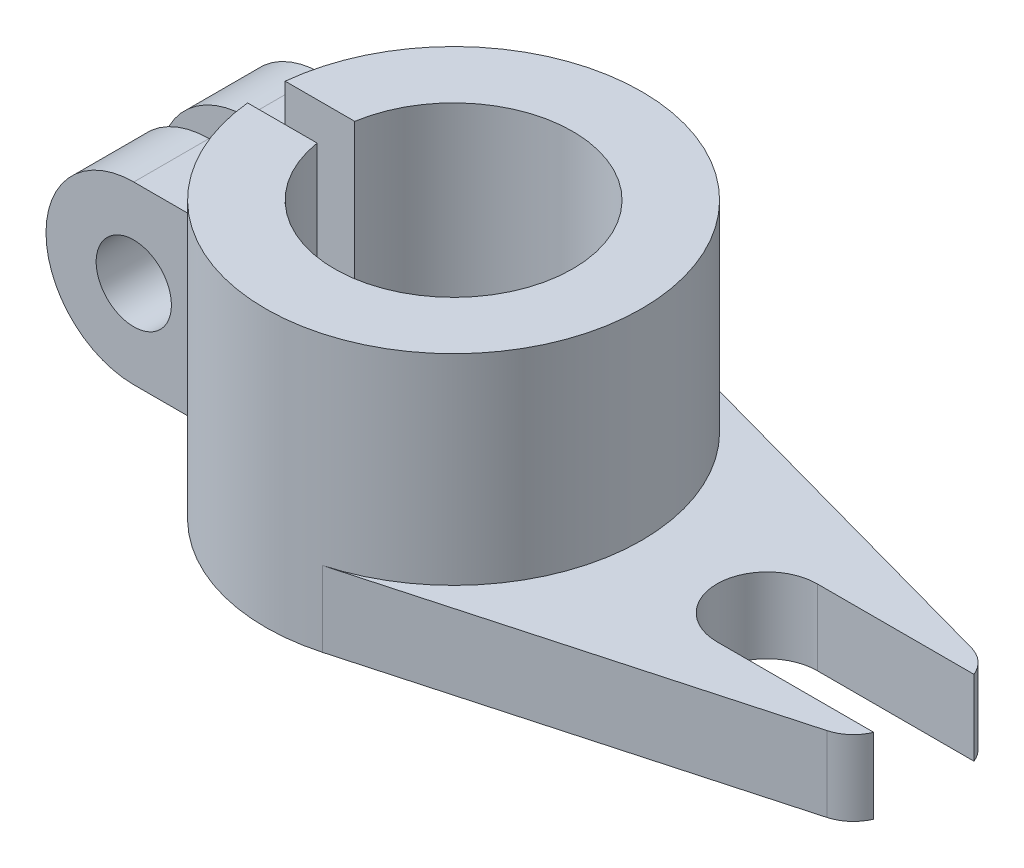
ISO-10303-21;
HEADER;
FILE_DESCRIPTION(('STEP AP214'),'2;1');
FILE_NAME('part.step','',(''),(''),'','','');
FILE_SCHEMA(('AUTOMOTIVE_DESIGN { 1 0 10303 214 1 1 1 1 }'));
ENDSEC;
DATA;
#1=APPLICATION_CONTEXT('core data for automotive mechanical design processes');
#2=APPLICATION_PROTOCOL_DEFINITION('international standard','automotive_design',2000,#1);
#3=PRODUCT_CONTEXT('',#1,'mechanical');
#4=PRODUCT('Part','Part','',(#3));
#5=PRODUCT_RELATED_PRODUCT_CATEGORY('part','',(#4));
#6=PRODUCT_DEFINITION_FORMATION('','',#4);
#7=PRODUCT_DEFINITION_CONTEXT('part definition',#1,'design');
#8=PRODUCT_DEFINITION('design','',#6,#7);
#9=PRODUCT_DEFINITION_SHAPE('','',#8);
#10=(LENGTH_UNIT() NAMED_UNIT(*) SI_UNIT(.MILLI.,.METRE.));
#11=(NAMED_UNIT(*) PLANE_ANGLE_UNIT() SI_UNIT($,.RADIAN.));
#12=(NAMED_UNIT(*) SI_UNIT($,.STERADIAN.) SOLID_ANGLE_UNIT());
#13=UNCERTAINTY_MEASURE_WITH_UNIT(LENGTH_MEASURE(1.E-05),#10,'distance_accuracy_value','');
#14=(GEOMETRIC_REPRESENTATION_CONTEXT(3) GLOBAL_UNCERTAINTY_ASSIGNED_CONTEXT((#13)) GLOBAL_UNIT_ASSIGNED_CONTEXT((#10,
#11,#12)) REPRESENTATION_CONTEXT('',''));
#15=CARTESIAN_POINT('',(0.,0.,0.));
#16=DIRECTION('',(0.,0.,1.));
#17=DIRECTION('',(1.,0.,0.));
#18=AXIS2_PLACEMENT_3D('',#15,#16,#17);
#19=CARTESIAN_POINT('',(0.,44.,0.));
#20=DIRECTION('',(0.,-1.,0.));
#21=DIRECTION('',(0.,0.,-1.));
#22=AXIS2_PLACEMENT_3D('',#19,#20,#21);
#23=CYLINDRICAL_SURFACE('',#22,30.);
#24=DIRECTION('',(0.,-1.,0.));
#25=VECTOR('',#24,1.);
#26=CARTESIAN_POINT('',(-29.8496231131986,44.,3.));
#27=LINE('',#26,#25);
#28=CARTESIAN_POINT('',(-29.8496231131986,0.,3.));
#29=VERTEX_POINT('',#28);
#30=CARTESIAN_POINT('',(-29.8496231131986,7.99999999999999,3.));
#31=VERTEX_POINT('',#30);
#32=EDGE_CURVE('E245',#29,#31,#27,.F.);
#33=ORIENTED_EDGE('',*,*,#32,.F.);
#34=CARTESIAN_POINT('',(0.,0.,0.));
#35=DIRECTION('',(0.,1.,0.));
#36=DIRECTION('',(0.,0.,1.));
#37=AXIS2_PLACEMENT_3D('',#34,#35,#36);
#38=CIRCLE('',#37,30.);
#39=CARTESIAN_POINT('',(7.9918924601898,0.,28.9159066070003));
#40=VERTEX_POINT('',#39);
#41=EDGE_CURVE('E361',#29,#40,#38,.T.);
#42=ORIENTED_EDGE('',*,*,#41,.T.);
#43=DIRECTION('',(0.,-1.,0.));
#44=VECTOR('',#43,1.);
#45=CARTESIAN_POINT('',(7.99189246018979,12.,28.9159066070003));
#46=LINE('',#45,#44);
#47=CARTESIAN_POINT('',(7.99189246018979,12.,28.9159066070003));
#48=VERTEX_POINT('',#47);
#49=EDGE_CURVE('E341',#48,#40,#46,.T.);
#50=ORIENTED_EDGE('',*,*,#49,.F.);
#51=CARTESIAN_POINT('',(0.,12.,0.));
#52=DIRECTION('',(0.,-1.,0.));
#53=DIRECTION('',(0.,0.,-1.));
#54=AXIS2_PLACEMENT_3D('',#51,#52,#53);
#55=CIRCLE('',#54,30.);
#56=CARTESIAN_POINT('',(7.9918924601898,12.,-28.9159066070003));
#57=VERTEX_POINT('',#56);
#58=EDGE_CURVE('E295',#57,#48,#55,.T.);
#59=ORIENTED_EDGE('',*,*,#58,.F.);
#60=DIRECTION('',(0.,-1.,0.));
#61=VECTOR('',#60,1.);
#62=CARTESIAN_POINT('',(7.99189246018979,12.,-28.9159066070003));
#63=LINE('',#62,#61);
#64=CARTESIAN_POINT('',(7.99189246018979,0.,-28.9159066070003));
#65=VERTEX_POINT('',#64);
#66=EDGE_CURVE('E345',#57,#65,#63,.T.);
#67=ORIENTED_EDGE('',*,*,#66,.T.);
#68=CARTESIAN_POINT('',(-29.8496231131986,0.,-2.99999999999999));
#69=VERTEX_POINT('',#68);
#70=EDGE_CURVE('E366',#65,#69,#38,.T.);
#71=ORIENTED_EDGE('',*,*,#70,.T.);
#72=DIRECTION('',(0.,-1.,0.));
#73=VECTOR('',#72,1.);
#74=CARTESIAN_POINT('',(-29.8496231131986,44.,-2.99999999999999));
#75=LINE('',#74,#73);
#76=CARTESIAN_POINT('',(-29.8496231131986,7.99999999999999,-2.99999999999999));
#77=VERTEX_POINT('',#76);
#78=EDGE_CURVE('E232',#77,#69,#75,.T.);
#79=ORIENTED_EDGE('',*,*,#78,.F.);
#80=CARTESIAN_POINT('',(0.,7.99999999999999,0.));
#81=DIRECTION('',(0.,1.,0.));
#82=DIRECTION('',(0.,0.,1.));
#83=AXIS2_PLACEMENT_3D('',#80,#81,#82);
#84=CIRCLE('',#83,30.);
#85=CARTESIAN_POINT('',(-25.9807621135332,7.99999999999999,-15.));
#86=VERTEX_POINT('',#85);
#87=EDGE_CURVE('E374',#86,#77,#84,.T.);
#88=ORIENTED_EDGE('',*,*,#87,.F.);
#89=DIRECTION('',(0.,-1.,0.));
#90=VECTOR('',#89,1.);
#91=CARTESIAN_POINT('',(-25.9807621135332,44.,-15.));
#92=LINE('',#91,#90);
#93=CARTESIAN_POINT('',(-25.9807621135332,36.,-15.));
#94=VERTEX_POINT('',#93);
#95=EDGE_CURVE('E365',#94,#86,#92,.T.);
#96=ORIENTED_EDGE('',*,*,#95,.F.);
#97=CARTESIAN_POINT('',(0.,36.,0.));
#98=DIRECTION('',(0.,1.,0.));
#99=DIRECTION('',(0.,0.,1.));
#100=AXIS2_PLACEMENT_3D('',#97,#98,#99);
#101=CIRCLE('',#100,30.);
#102=CARTESIAN_POINT('',(-29.8496231131986,36.,-2.99999999999999));
#103=VERTEX_POINT('',#102);
#104=EDGE_CURVE('E378',#94,#103,#101,.T.);
#105=ORIENTED_EDGE('',*,*,#104,.T.);
#106=CARTESIAN_POINT('',(-29.8496231131986,44.,-2.99999999999999));
#107=VERTEX_POINT('',#106);
#108=EDGE_CURVE('E235',#107,#103,#75,.T.);
#109=ORIENTED_EDGE('',*,*,#108,.F.);
#110=CARTESIAN_POINT('',(0.,44.,0.));
#111=DIRECTION('',(0.,1.,0.));
#112=DIRECTION('',(0.,0.,1.));
#113=AXIS2_PLACEMENT_3D('',#110,#111,#112);
#114=CIRCLE('',#113,30.);
#115=CARTESIAN_POINT('',(-29.8496231131986,44.,3.));
#116=VERTEX_POINT('',#115);
#117=EDGE_CURVE('E362',#116,#107,#114,.T.);
#118=ORIENTED_EDGE('',*,*,#117,.F.);
#119=CARTESIAN_POINT('',(-29.8496231131986,36.,3.));
#120=VERTEX_POINT('',#119);
#121=EDGE_CURVE('E188',#120,#116,#27,.F.);
#122=ORIENTED_EDGE('',*,*,#121,.F.);
#123=CARTESIAN_POINT('',(-25.9807621135332,36.,15.));
#124=VERTEX_POINT('',#123);
#125=EDGE_CURVE('E69',#120,#124,#101,.T.);
#126=ORIENTED_EDGE('',*,*,#125,.T.);
#127=DIRECTION('',(0.,-1.,0.));
#128=VECTOR('',#127,1.);
#129=CARTESIAN_POINT('',(-25.9807621135332,44.,15.));
#130=LINE('',#129,#128);
#131=CARTESIAN_POINT('',(-25.9807621135332,7.99999999999999,15.));
#132=VERTEX_POINT('',#131);
#133=EDGE_CURVE('E382',#124,#132,#130,.T.);
#134=ORIENTED_EDGE('',*,*,#133,.T.);
#135=EDGE_CURVE('E373',#31,#132,#84,.T.);
#136=ORIENTED_EDGE('',*,*,#135,.F.);
#137=EDGE_LOOP('',(#33,#42,#50,#59,#67,#71,#79,#88,#96,#105,#109,#118,#122,#126,#134,#136));
#138=FACE_BOUND('',#137,.T.);
#139=ADVANCED_FACE('F45',(#138),#23,.T.);
#140=CARTESIAN_POINT('',(0.,44.,0.));
#141=DIRECTION('',(0.,1.,0.));
#142=DIRECTION('',(0.,0.,1.));
#143=AXIS2_PLACEMENT_3D('',#140,#141,#142);
#144=PLANE('',#143);
#145=CARTESIAN_POINT('',(0.,44.,0.));
#146=DIRECTION('',(0.,1.,0.));
#147=DIRECTION('',(0.,0.,1.));
#148=AXIS2_PLACEMENT_3D('',#145,#146,#147);
#149=CIRCLE('',#148,19.);
#150=CARTESIAN_POINT('',(-18.7616630392937,44.,2.99999999999998));
#151=VERTEX_POINT('',#150);
#152=CARTESIAN_POINT('',(-18.7616630392937,44.,-2.99999999999999));
#153=VERTEX_POINT('',#152);
#154=EDGE_CURVE('E194',#151,#153,#149,.T.);
#155=ORIENTED_EDGE('',*,*,#154,.F.);
#156=DIRECTION('',(1.,0.,0.));
#157=VECTOR('',#156,1.);
#158=CARTESIAN_POINT('',(-18.7616630392937,44.,3.));
#159=LINE('',#158,#157);
#160=EDGE_CURVE('E183',#116,#151,#159,.T.);
#161=ORIENTED_EDGE('',*,*,#160,.F.);
#162=ORIENTED_EDGE('',*,*,#117,.T.);
#163=DIRECTION('',(-1.,0.,0.));
#164=VECTOR('',#163,1.);
#165=CARTESIAN_POINT('',(-72.5660450660451,44.,-2.99999999999999));
#166=LINE('',#165,#164);
#167=EDGE_CURVE('E208',#153,#107,#166,.T.);
#168=ORIENTED_EDGE('',*,*,#167,.F.);
#169=EDGE_LOOP('',(#155,#161,#162,#168));
#170=FACE_BOUND('',#169,.T.);
#171=ADVANCED_FACE('F207',(#170),#144,.T.);
#172=CARTESIAN_POINT('',(0.,0.,0.));
#173=DIRECTION('',(0.,1.,0.));
#174=DIRECTION('',(0.,0.,1.));
#175=AXIS2_PLACEMENT_3D('',#172,#173,#174);
#176=PLANE('',#175);
#177=DIRECTION('',(1.,0.,0.));
#178=VECTOR('',#177,1.);
#179=CARTESIAN_POINT('',(-18.7616630392937,0.,3.));
#180=LINE('',#179,#178);
#181=CARTESIAN_POINT('',(-18.7616630392937,0.,2.99999999999998));
#182=VERTEX_POINT('',#181);
#183=EDGE_CURVE('E215',#29,#182,#180,.T.);
#184=ORIENTED_EDGE('',*,*,#183,.T.);
#185=CARTESIAN_POINT('',(0.,0.,0.));
#186=DIRECTION('',(0.,1.,0.));
#187=DIRECTION('',(0.,0.,1.));
#188=AXIS2_PLACEMENT_3D('',#185,#186,#187);
#189=CIRCLE('',#188,19.);
#190=CARTESIAN_POINT('',(-18.7616630392937,0.,-2.99999999999999));
#191=VERTEX_POINT('',#190);
#192=EDGE_CURVE('E201',#182,#191,#189,.T.);
#193=ORIENTED_EDGE('',*,*,#192,.T.);
#194=DIRECTION('',(-1.,0.,0.));
#195=VECTOR('',#194,1.);
#196=CARTESIAN_POINT('',(-72.5660450660451,0.,-2.99999999999999));
#197=LINE('',#196,#195);
#198=EDGE_CURVE('E195',#191,#69,#197,.T.);
#199=ORIENTED_EDGE('',*,*,#198,.T.);
#200=ORIENTED_EDGE('',*,*,#70,.F.);
#201=DIRECTION('',(-0.963863553566675,0.,-0.26639641533966));
#202=VECTOR('',#201,1.);
#203=CARTESIAN_POINT('',(7.99189246018979,0.,-28.9159066070003));
#204=LINE('',#203,#202);
#205=CARTESIAN_POINT('',(71.0554909668791,0.,-11.4861402065225));
#206=VERTEX_POINT('',#205);
#207=EDGE_CURVE('E318',#206,#65,#204,.T.);
#208=ORIENTED_EDGE('',*,*,#207,.F.);
#209=CARTESIAN_POINT('',(69.4571124748411,0.,-5.70295888512242));
#210=DIRECTION('',(0.,1.,0.));
#211=DIRECTION('',(0.,0.,1.));
#212=AXIS2_PLACEMENT_3D('',#209,#210,#211);
#213=CIRCLE('',#212,6.);
#214=CARTESIAN_POINT('',(75.,0.,-8.));
#215=VERTEX_POINT('',#214);
#216=EDGE_CURVE('E315',#215,#206,#213,.T.);
#217=ORIENTED_EDGE('',*,*,#216,.F.);
#218=DIRECTION('',(1.,0.,0.));
#219=VECTOR('',#218,1.);
#220=CARTESIAN_POINT('',(50.,0.,-8.));
#221=LINE('',#220,#219);
#222=CARTESIAN_POINT('',(50.,0.,-8.));
#223=VERTEX_POINT('',#222);
#224=EDGE_CURVE('E312',#223,#215,#221,.T.);
#225=ORIENTED_EDGE('',*,*,#224,.F.);
#226=CARTESIAN_POINT('',(50.,0.,0.));
#227=DIRECTION('',(0.,-1.,0.));
#228=DIRECTION('',(0.,0.,1.));
#229=AXIS2_PLACEMENT_3D('',#226,#227,#228);
#230=CIRCLE('',#229,8.);
#231=CARTESIAN_POINT('',(50.,0.,8.));
#232=VERTEX_POINT('',#231);
#233=EDGE_CURVE('E274',#232,#223,#230,.T.);
#234=ORIENTED_EDGE('',*,*,#233,.F.);
#235=DIRECTION('',(-1.,0.,0.));
#236=VECTOR('',#235,1.);
#237=CARTESIAN_POINT('',(50.,0.,8.));
#238=LINE('',#237,#236);
#239=CARTESIAN_POINT('',(75.,0.,8.));
#240=VERTEX_POINT('',#239);
#241=EDGE_CURVE('E285',#240,#232,#238,.T.);
#242=ORIENTED_EDGE('',*,*,#241,.F.);
#243=CARTESIAN_POINT('',(69.4571124748411,0.,5.70295888512242));
#244=DIRECTION('',(0.,1.,0.));
#245=DIRECTION('',(0.,0.,-1.));
#246=AXIS2_PLACEMENT_3D('',#243,#244,#245);
#247=CIRCLE('',#246,6.);
#248=CARTESIAN_POINT('',(71.0554909668791,0.,11.4861402065225));
#249=VERTEX_POINT('',#248);
#250=EDGE_CURVE('E325',#249,#240,#247,.T.);
#251=ORIENTED_EDGE('',*,*,#250,.F.);
#252=DIRECTION('',(0.963863553566675,0.,-0.26639641533966));
#253=VECTOR('',#252,1.);
#254=CARTESIAN_POINT('',(7.99189246018979,0.,28.9159066070003));
#255=LINE('',#254,#253);
#256=EDGE_CURVE('E322',#40,#249,#255,.T.);
#257=ORIENTED_EDGE('',*,*,#256,.F.);
#258=ORIENTED_EDGE('',*,*,#41,.F.);
#259=EDGE_LOOP('',(#184,#193,#199,#200,#208,#217,#225,#234,#242,#251,#257,#258));
#260=FACE_BOUND('',#259,.T.);
#261=ADVANCED_FACE('F427',(#260),#176,.F.);
#262=CARTESIAN_POINT('',(-36.,36.,15.));
#263=DIRECTION('',(0.,1.,0.));
#264=DIRECTION('',(0.,0.,1.));
#265=AXIS2_PLACEMENT_3D('',#262,#263,#264);
#266=PLANE('',#265);
#267=ORIENTED_EDGE('',*,*,#125,.F.);
#268=DIRECTION('',(-1.,0.,0.));
#269=VECTOR('',#268,1.);
#270=CARTESIAN_POINT('',(-36.,36.,3.));
#271=LINE('',#270,#269);
#272=CARTESIAN_POINT('',(-36.,36.,3.));
#273=VERTEX_POINT('',#272);
#274=EDGE_CURVE('E239',#120,#273,#271,.T.);
#275=ORIENTED_EDGE('',*,*,#274,.T.);
#276=DIRECTION('',(0.,0.,-1.));
#277=VECTOR('',#276,1.);
#278=CARTESIAN_POINT('',(-36.,36.,15.));
#279=LINE('',#278,#277);
#280=CARTESIAN_POINT('',(-36.,36.,15.));
#281=VERTEX_POINT('',#280);
#282=EDGE_CURVE('E270',#281,#273,#279,.T.);
#283=ORIENTED_EDGE('',*,*,#282,.F.);
#284=DIRECTION('',(1.,0.,0.));
#285=VECTOR('',#284,1.);
#286=CARTESIAN_POINT('',(-36.,36.,15.));
#287=LINE('',#286,#285);
#288=EDGE_CURVE('E246',#281,#124,#287,.T.);
#289=ORIENTED_EDGE('',*,*,#288,.T.);
#290=EDGE_LOOP('',(#267,#275,#283,#289));
#291=FACE_BOUND('',#290,.T.);
#292=ADVANCED_FACE('F450',(#291),#266,.T.);
#293=CARTESIAN_POINT('',(-36.,36.,-2.99999999999999));
#294=VERTEX_POINT('',#293);
#295=CARTESIAN_POINT('',(-36.,36.,-15.));
#296=VERTEX_POINT('',#295);
#297=EDGE_CURVE('E275',#294,#296,#279,.T.);
#298=ORIENTED_EDGE('',*,*,#297,.F.);
#299=DIRECTION('',(1.,0.,0.));
#300=VECTOR('',#299,1.);
#301=CARTESIAN_POINT('',(-36.,36.,-2.99999999999999));
#302=LINE('',#301,#300);
#303=EDGE_CURVE('E228',#294,#103,#302,.T.);
#304=ORIENTED_EDGE('',*,*,#303,.T.);
#305=ORIENTED_EDGE('',*,*,#104,.F.);
#306=DIRECTION('',(1.,0.,0.));
#307=VECTOR('',#306,1.);
#308=CARTESIAN_POINT('',(-36.,36.,-15.));
#309=LINE('',#308,#307);
#310=EDGE_CURVE('E259',#296,#94,#309,.T.);
#311=ORIENTED_EDGE('',*,*,#310,.F.);
#312=EDGE_LOOP('',(#298,#304,#305,#311));
#313=FACE_BOUND('',#312,.T.);
#314=ADVANCED_FACE('F402',(#313),#266,.T.);
#315=CARTESIAN_POINT('',(-36.,22.,15.));
#316=DIRECTION('',(0.,0.,-1.));
#317=DIRECTION('',(-1.,0.,0.));
#318=AXIS2_PLACEMENT_3D('',#315,#316,#317);
#319=CYLINDRICAL_SURFACE('',#318,14.);
#320=CARTESIAN_POINT('',(-36.,22.,3.));
#321=DIRECTION('',(0.,0.,-1.));
#322=DIRECTION('',(-1.,0.,0.));
#323=AXIS2_PLACEMENT_3D('',#320,#321,#322);
#324=CIRCLE('',#323,14.);
#325=CARTESIAN_POINT('',(-36.,7.99999999999999,3.));
#326=VERTEX_POINT('',#325);
#327=EDGE_CURVE('E236',#326,#273,#324,.T.);
#328=ORIENTED_EDGE('',*,*,#327,.F.);
#329=DIRECTION('',(0.,0.,-1.));
#330=VECTOR('',#329,1.);
#331=CARTESIAN_POINT('',(-36.,7.99999999999999,15.));
#332=LINE('',#331,#330);
#333=CARTESIAN_POINT('',(-36.,7.99999999999999,15.));
#334=VERTEX_POINT('',#333);
#335=EDGE_CURVE('E276',#334,#326,#332,.T.);
#336=ORIENTED_EDGE('',*,*,#335,.F.);
#337=CARTESIAN_POINT('',(-36.,22.,15.));
#338=DIRECTION('',(0.,0.,1.));
#339=DIRECTION('',(1.,0.,0.));
#340=AXIS2_PLACEMENT_3D('',#337,#338,#339);
#341=CIRCLE('',#340,14.);
#342=EDGE_CURVE('E255',#281,#334,#341,.T.);
#343=ORIENTED_EDGE('',*,*,#342,.F.);
#344=ORIENTED_EDGE('',*,*,#282,.T.);
#345=EDGE_LOOP('',(#328,#336,#343,#344));
#346=FACE_BOUND('',#345,.T.);
#347=ADVANCED_FACE('F456',(#346),#319,.T.);
#348=CARTESIAN_POINT('',(-36.,22.,-2.99999999999999));
#349=DIRECTION('',(0.,0.,1.));
#350=DIRECTION('',(1.,0.,0.));
#351=AXIS2_PLACEMENT_3D('',#348,#349,#350);
#352=CIRCLE('',#351,14.);
#353=CARTESIAN_POINT('',(-36.,7.99999999999999,-2.99999999999999));
#354=VERTEX_POINT('',#353);
#355=EDGE_CURVE('E61',#294,#354,#352,.T.);
#356=ORIENTED_EDGE('',*,*,#355,.F.);
#357=ORIENTED_EDGE('',*,*,#297,.T.);
#358=CARTESIAN_POINT('',(-36.,22.,-15.));
#359=DIRECTION('',(0.,0.,1.));
#360=DIRECTION('',(1.,0.,0.));
#361=AXIS2_PLACEMENT_3D('',#358,#359,#360);
#362=CIRCLE('',#361,14.);
#363=CARTESIAN_POINT('',(-36.,7.99999999999999,-15.));
#364=VERTEX_POINT('',#363);
#365=EDGE_CURVE('E251',#296,#364,#362,.T.);
#366=ORIENTED_EDGE('',*,*,#365,.T.);
#367=EDGE_CURVE('E258',#354,#364,#332,.T.);
#368=ORIENTED_EDGE('',*,*,#367,.F.);
#369=EDGE_LOOP('',(#356,#357,#366,#368));
#370=FACE_BOUND('',#369,.T.);
#371=ADVANCED_FACE('F404',(#370),#319,.T.);
#372=CARTESIAN_POINT('',(-36.,7.99999999999999,15.));
#373=DIRECTION('',(0.,1.,0.));
#374=DIRECTION('',(0.,0.,1.));
#375=AXIS2_PLACEMENT_3D('',#372,#373,#374);
#376=PLANE('',#375);
#377=DIRECTION('',(-1.,0.,0.));
#378=VECTOR('',#377,1.);
#379=CARTESIAN_POINT('',(-36.,7.99999999999999,3.));
#380=LINE('',#379,#378);
#381=EDGE_CURVE('E11',#31,#326,#380,.T.);
#382=ORIENTED_EDGE('',*,*,#381,.F.);
#383=ORIENTED_EDGE('',*,*,#135,.T.);
#384=DIRECTION('',(1.,0.,0.));
#385=VECTOR('',#384,1.);
#386=CARTESIAN_POINT('',(-36.,7.99999999999999,15.));
#387=LINE('',#386,#385);
#388=EDGE_CURVE('E250',#334,#132,#387,.T.);
#389=ORIENTED_EDGE('',*,*,#388,.F.);
#390=ORIENTED_EDGE('',*,*,#335,.T.);
#391=EDGE_LOOP('',(#382,#383,#389,#390));
#392=FACE_BOUND('',#391,.T.);
#393=ADVANCED_FACE('F414',(#392),#376,.F.);
#394=DIRECTION('',(1.,0.,0.));
#395=VECTOR('',#394,1.);
#396=CARTESIAN_POINT('',(-36.,7.99999999999999,-2.99999999999999));
#397=LINE('',#396,#395);
#398=EDGE_CURVE('E54',#354,#77,#397,.T.);
#399=ORIENTED_EDGE('',*,*,#398,.F.);
#400=ORIENTED_EDGE('',*,*,#367,.T.);
#401=DIRECTION('',(1.,0.,0.));
#402=VECTOR('',#401,1.);
#403=CARTESIAN_POINT('',(-36.,7.99999999999999,-15.));
#404=LINE('',#403,#402);
#405=EDGE_CURVE('E263',#364,#86,#404,.T.);
#406=ORIENTED_EDGE('',*,*,#405,.T.);
#407=ORIENTED_EDGE('',*,*,#87,.T.);
#408=EDGE_LOOP('',(#399,#400,#406,#407));
#409=FACE_BOUND('',#408,.T.);
#410=ADVANCED_FACE('F392',(#409),#376,.F.);
#411=CARTESIAN_POINT('',(50.,12.,0.));
#412=DIRECTION('',(0.,-1.,0.));
#413=DIRECTION('',(0.,0.,-1.));
#414=AXIS2_PLACEMENT_3D('',#411,#412,#413);
#415=CYLINDRICAL_SURFACE('',#414,8.);
#416=ORIENTED_EDGE('',*,*,#233,.T.);
#417=DIRECTION('',(0.,-1.,0.));
#418=VECTOR('',#417,1.);
#419=CARTESIAN_POINT('',(50.,12.,-8.));
#420=LINE('',#419,#418);
#421=CARTESIAN_POINT('',(50.,12.,-8.));
#422=VERTEX_POINT('',#421);
#423=EDGE_CURVE('E357',#422,#223,#420,.T.);
#424=ORIENTED_EDGE('',*,*,#423,.F.);
#425=CARTESIAN_POINT('',(50.,12.,0.));
#426=DIRECTION('',(0.,-1.,0.));
#427=DIRECTION('',(0.,0.,1.));
#428=AXIS2_PLACEMENT_3D('',#425,#426,#427);
#429=CIRCLE('',#428,8.);
#430=CARTESIAN_POINT('',(50.,12.,8.));
#431=VERTEX_POINT('',#430);
#432=EDGE_CURVE('E280',#431,#422,#429,.T.);
#433=ORIENTED_EDGE('',*,*,#432,.F.);
#434=DIRECTION('',(0.,-1.,0.));
#435=VECTOR('',#434,1.);
#436=CARTESIAN_POINT('',(50.,12.,8.));
#437=LINE('',#436,#435);
#438=EDGE_CURVE('E308',#431,#232,#437,.T.);
#439=ORIENTED_EDGE('',*,*,#438,.T.);
#440=EDGE_LOOP('',(#416,#424,#433,#439));
#441=FACE_BOUND('',#440,.T.);
#442=ADVANCED_FACE('F476',(#441),#415,.F.);
#443=CARTESIAN_POINT('',(50.,12.,-8.));
#444=DIRECTION('',(0.,0.,-1.));
#445=DIRECTION('',(-1.,0.,0.));
#446=AXIS2_PLACEMENT_3D('',#443,#444,#445);
#447=PLANE('',#446);
#448=ORIENTED_EDGE('',*,*,#224,.T.);
#449=DIRECTION('',(0.,-1.,0.));
#450=VECTOR('',#449,1.);
#451=CARTESIAN_POINT('',(75.,12.,-8.));
#452=LINE('',#451,#450);
#453=CARTESIAN_POINT('',(75.,12.,-8.));
#454=VERTEX_POINT('',#453);
#455=EDGE_CURVE('E353',#454,#215,#452,.T.);
#456=ORIENTED_EDGE('',*,*,#455,.F.);
#457=DIRECTION('',(1.,0.,0.));
#458=VECTOR('',#457,1.);
#459=CARTESIAN_POINT('',(50.,12.,-8.));
#460=LINE('',#459,#458);
#461=EDGE_CURVE('E284',#422,#454,#460,.T.);
#462=ORIENTED_EDGE('',*,*,#461,.F.);
#463=ORIENTED_EDGE('',*,*,#423,.T.);
#464=EDGE_LOOP('',(#448,#456,#462,#463));
#465=FACE_BOUND('',#464,.T.);
#466=ADVANCED_FACE('F479',(#465),#447,.F.);
#467=CARTESIAN_POINT('',(69.4571124748411,12.,-5.70295888512242));
#468=DIRECTION('',(0.,-1.,0.));
#469=DIRECTION('',(0.,0.,-1.));
#470=AXIS2_PLACEMENT_3D('',#467,#468,#469);
#471=CYLINDRICAL_SURFACE('',#470,6.);
#472=ORIENTED_EDGE('',*,*,#216,.T.);
#473=DIRECTION('',(0.,-1.,0.));
#474=VECTOR('',#473,1.);
#475=CARTESIAN_POINT('',(71.0554909668791,12.,-11.4861402065225));
#476=LINE('',#475,#474);
#477=CARTESIAN_POINT('',(71.0554909668791,12.,-11.4861402065225));
#478=VERTEX_POINT('',#477);
#479=EDGE_CURVE('E349',#478,#206,#476,.T.);
#480=ORIENTED_EDGE('',*,*,#479,.F.);
#481=CARTESIAN_POINT('',(69.4571124748411,12.,-5.70295888512242));
#482=DIRECTION('',(0.,1.,0.));
#483=DIRECTION('',(0.,0.,1.));
#484=AXIS2_PLACEMENT_3D('',#481,#482,#483);
#485=CIRCLE('',#484,6.);
#486=EDGE_CURVE('E288',#454,#478,#485,.T.);
#487=ORIENTED_EDGE('',*,*,#486,.F.);
#488=ORIENTED_EDGE('',*,*,#455,.T.);
#489=EDGE_LOOP('',(#472,#480,#487,#488));
#490=FACE_BOUND('',#489,.T.);
#491=ADVANCED_FACE('F483',(#490),#471,.T.);
#492=CARTESIAN_POINT('',(7.99189246018979,12.,-28.9159066070003));
#493=DIRECTION('',(-0.26639641533966,0.,0.963863553566675));
#494=DIRECTION('',(0.963863553566675,0.,0.26639641533966));
#495=AXIS2_PLACEMENT_3D('',#492,#493,#494);
#496=PLANE('',#495);
#497=ORIENTED_EDGE('',*,*,#207,.T.);
#498=ORIENTED_EDGE('',*,*,#66,.F.);
#499=DIRECTION('',(-0.963863553566675,0.,-0.26639641533966));
#500=VECTOR('',#499,1.);
#501=CARTESIAN_POINT('',(7.99189246018979,12.,-28.9159066070003));
#502=LINE('',#501,#500);
#503=EDGE_CURVE('E291',#478,#57,#502,.T.);
#504=ORIENTED_EDGE('',*,*,#503,.F.);
#505=ORIENTED_EDGE('',*,*,#479,.T.);
#506=EDGE_LOOP('',(#497,#498,#504,#505));
#507=FACE_BOUND('',#506,.T.);
#508=ADVANCED_FACE('F446',(#507),#496,.F.);
#509=CARTESIAN_POINT('',(7.99189246018979,12.,28.9159066070003));
#510=DIRECTION('',(-0.26639641533966,0.,-0.963863553566675));
#511=DIRECTION('',(-0.963863553566675,0.,0.26639641533966));
#512=AXIS2_PLACEMENT_3D('',#509,#510,#511);
#513=PLANE('',#512);
#514=ORIENTED_EDGE('',*,*,#256,.T.);
#515=DIRECTION('',(0.,-1.,0.));
#516=VECTOR('',#515,1.);
#517=CARTESIAN_POINT('',(71.0554909668791,12.,11.4861402065225));
#518=LINE('',#517,#516);
#519=CARTESIAN_POINT('',(71.0554909668791,12.,11.4861402065225));
#520=VERTEX_POINT('',#519);
#521=EDGE_CURVE('E337',#520,#249,#518,.T.);
#522=ORIENTED_EDGE('',*,*,#521,.F.);
#523=DIRECTION('',(0.963863553566675,0.,-0.26639641533966));
#524=VECTOR('',#523,1.);
#525=CARTESIAN_POINT('',(7.99189246018979,12.,28.9159066070003));
#526=LINE('',#525,#524);
#527=EDGE_CURVE('E299',#48,#520,#526,.T.);
#528=ORIENTED_EDGE('',*,*,#527,.F.);
#529=ORIENTED_EDGE('',*,*,#49,.T.);
#530=EDGE_LOOP('',(#514,#522,#528,#529));
#531=FACE_BOUND('',#530,.T.);
#532=ADVANCED_FACE('F424',(#531),#513,.F.);
#533=CARTESIAN_POINT('',(69.4571124748411,12.,5.70295888512242));
#534=DIRECTION('',(0.,-1.,0.));
#535=DIRECTION('',(0.,0.,-1.));
#536=AXIS2_PLACEMENT_3D('',#533,#534,#535);
#537=CYLINDRICAL_SURFACE('',#536,6.);
#538=ORIENTED_EDGE('',*,*,#250,.T.);
#539=DIRECTION('',(0.,-1.,0.));
#540=VECTOR('',#539,1.);
#541=CARTESIAN_POINT('',(75.,12.,8.));
#542=LINE('',#541,#540);
#543=CARTESIAN_POINT('',(75.,12.,8.));
#544=VERTEX_POINT('',#543);
#545=EDGE_CURVE('E333',#544,#240,#542,.T.);
#546=ORIENTED_EDGE('',*,*,#545,.F.);
#547=CARTESIAN_POINT('',(69.4571124748411,12.,5.70295888512242));
#548=DIRECTION('',(0.,1.,0.));
#549=DIRECTION('',(0.,0.,-1.));
#550=AXIS2_PLACEMENT_3D('',#547,#548,#549);
#551=CIRCLE('',#550,6.);
#552=EDGE_CURVE('E302',#520,#544,#551,.T.);
#553=ORIENTED_EDGE('',*,*,#552,.F.);
#554=ORIENTED_EDGE('',*,*,#521,.T.);
#555=EDGE_LOOP('',(#538,#546,#553,#554));
#556=FACE_BOUND('',#555,.T.);
#557=ADVANCED_FACE('F432',(#556),#537,.T.);
#558=CARTESIAN_POINT('',(50.,12.,8.));
#559=DIRECTION('',(0.,0.,1.));
#560=DIRECTION('',(1.,0.,0.));
#561=AXIS2_PLACEMENT_3D('',#558,#559,#560);
#562=PLANE('',#561);
#563=ORIENTED_EDGE('',*,*,#241,.T.);
#564=ORIENTED_EDGE('',*,*,#438,.F.);
#565=DIRECTION('',(-1.,0.,0.));
#566=VECTOR('',#565,1.);
#567=CARTESIAN_POINT('',(50.,12.,8.));
#568=LINE('',#567,#566);
#569=EDGE_CURVE('E305',#544,#431,#568,.T.);
#570=ORIENTED_EDGE('',*,*,#569,.F.);
#571=ORIENTED_EDGE('',*,*,#545,.T.);
#572=EDGE_LOOP('',(#563,#564,#570,#571));
#573=FACE_BOUND('',#572,.T.);
#574=ADVANCED_FACE('F436',(#573),#562,.F.);
#575=CARTESIAN_POINT('',(50.,12.,0.));
#576=DIRECTION('',(0.,1.,0.));
#577=DIRECTION('',(0.,0.,1.));
#578=AXIS2_PLACEMENT_3D('',#575,#576,#577);
#579=PLANE('',#578);
#580=ORIENTED_EDGE('',*,*,#432,.T.);
#581=ORIENTED_EDGE('',*,*,#461,.T.);
#582=ORIENTED_EDGE('',*,*,#486,.T.);
#583=ORIENTED_EDGE('',*,*,#503,.T.);
#584=ORIENTED_EDGE('',*,*,#58,.T.);
#585=ORIENTED_EDGE('',*,*,#527,.T.);
#586=ORIENTED_EDGE('',*,*,#552,.T.);
#587=ORIENTED_EDGE('',*,*,#569,.T.);
#588=EDGE_LOOP('',(#580,#581,#582,#583,#584,#585,#586,#587));
#589=FACE_BOUND('',#588,.T.);
#590=ADVANCED_FACE('F440',(#589),#579,.T.);
#591=CARTESIAN_POINT('',(-36.,22.,15.));
#592=DIRECTION('',(0.,0.,1.));
#593=DIRECTION('',(1.,0.,0.));
#594=AXIS2_PLACEMENT_3D('',#591,#592,#593);
#595=PLANE('',#594);
#596=CARTESIAN_POINT('',(-36.,22.,15.));
#597=DIRECTION('',(0.,0.,1.));
#598=DIRECTION('',(1.,0.,0.));
#599=AXIS2_PLACEMENT_3D('',#596,#597,#598);
#600=CIRCLE('',#599,6.);
#601=CARTESIAN_POINT('',(-30.,22.,15.));
#602=VERTEX_POINT('',#601);
#603=EDGE_CURVE('E617',#602,#602,#600,.T.);
#604=ORIENTED_EDGE('',*,*,#603,.F.);
#605=EDGE_LOOP('',(#604));
#606=FACE_BOUND('',#605,.T.);
#607=ORIENTED_EDGE('',*,*,#133,.F.);
#608=ORIENTED_EDGE('',*,*,#288,.F.);
#609=ORIENTED_EDGE('',*,*,#342,.T.);
#610=ORIENTED_EDGE('',*,*,#388,.T.);
#611=EDGE_LOOP('',(#607,#608,#609,#610));
#612=FACE_BOUND('',#611,.T.);
#613=ADVANCED_FACE('F454',(#606,#612),#595,.T.);
#614=CARTESIAN_POINT('',(-36.,22.,-15.));
#615=DIRECTION('',(0.,0.,1.));
#616=DIRECTION('',(1.,0.,0.));
#617=AXIS2_PLACEMENT_3D('',#614,#615,#616);
#618=PLANE('',#617);
#619=CARTESIAN_POINT('',(-36.,22.,-15.));
#620=DIRECTION('',(0.,0.,1.));
#621=DIRECTION('',(1.,0.,0.));
#622=AXIS2_PLACEMENT_3D('',#619,#620,#621);
#623=CIRCLE('',#622,6.);
#624=CARTESIAN_POINT('',(-30.,22.,-15.));
#625=VERTEX_POINT('',#624);
#626=EDGE_CURVE('E218',#625,#625,#623,.T.);
#627=ORIENTED_EDGE('',*,*,#626,.T.);
#628=EDGE_LOOP('',(#627));
#629=FACE_BOUND('',#628,.T.);
#630=ORIENTED_EDGE('',*,*,#310,.T.);
#631=ORIENTED_EDGE('',*,*,#95,.T.);
#632=ORIENTED_EDGE('',*,*,#405,.F.);
#633=ORIENTED_EDGE('',*,*,#365,.F.);
#634=EDGE_LOOP('',(#630,#631,#632,#633));
#635=FACE_BOUND('',#634,.T.);
#636=ADVANCED_FACE('F396',(#629,#635),#618,.F.);
#637=CARTESIAN_POINT('',(-18.7616630392937,44.,3.));
#638=DIRECTION('',(0.,0.,-1.));
#639=DIRECTION('',(-1.,0.,0.));
#640=AXIS2_PLACEMENT_3D('',#637,#638,#639);
#641=PLANE('',#640);
#642=CARTESIAN_POINT('',(-36.,22.,3.));
#643=DIRECTION('',(0.,0.,-1.));
#644=DIRECTION('',(-1.,0.,0.));
#645=AXIS2_PLACEMENT_3D('',#642,#643,#644);
#646=CIRCLE('',#645,6.);
#647=CARTESIAN_POINT('',(-30.,22.,3.));
#648=VERTEX_POINT('',#647);
#649=EDGE_CURVE('E614',#648,#648,#646,.T.);
#650=ORIENTED_EDGE('',*,*,#649,.F.);
#651=EDGE_LOOP('',(#650));
#652=FACE_BOUND('',#651,.T.);
#653=ORIENTED_EDGE('',*,*,#32,.T.);
#654=ORIENTED_EDGE('',*,*,#381,.T.);
#655=ORIENTED_EDGE('',*,*,#327,.T.);
#656=ORIENTED_EDGE('',*,*,#274,.F.);
#657=ORIENTED_EDGE('',*,*,#121,.T.);
#658=ORIENTED_EDGE('',*,*,#160,.T.);
#659=DIRECTION('',(0.,-1.,0.));
#660=VECTOR('',#659,1.);
#661=CARTESIAN_POINT('',(-18.7616630392937,44.,2.99999999999998));
#662=LINE('',#661,#660);
#663=EDGE_CURVE('E186',#151,#182,#662,.T.);
#664=ORIENTED_EDGE('',*,*,#663,.T.);
#665=ORIENTED_EDGE('',*,*,#183,.F.);
#666=EDGE_LOOP('',(#653,#654,#655,#656,#657,#658,#664,#665));
#667=FACE_BOUND('',#666,.T.);
#668=ADVANCED_FACE('F185',(#652,#667),#641,.T.);
#669=CARTESIAN_POINT('',(-72.5660450660451,44.,-2.99999999999999));
#670=DIRECTION('',(0.,0.,1.));
#671=DIRECTION('',(1.,0.,0.));
#672=AXIS2_PLACEMENT_3D('',#669,#670,#671);
#673=PLANE('',#672);
#674=CARTESIAN_POINT('',(-36.,22.,-2.99999999999999));
#675=DIRECTION('',(0.,0.,1.));
#676=DIRECTION('',(1.,0.,0.));
#677=AXIS2_PLACEMENT_3D('',#674,#675,#676);
#678=CIRCLE('',#677,6.);
#679=CARTESIAN_POINT('',(-30.,22.,-2.99999999999999));
#680=VERTEX_POINT('',#679);
#681=EDGE_CURVE('E48',#680,#680,#678,.T.);
#682=ORIENTED_EDGE('',*,*,#681,.F.);
#683=EDGE_LOOP('',(#682));
#684=FACE_BOUND('',#683,.T.);
#685=ORIENTED_EDGE('',*,*,#108,.T.);
#686=ORIENTED_EDGE('',*,*,#303,.F.);
#687=ORIENTED_EDGE('',*,*,#355,.T.);
#688=ORIENTED_EDGE('',*,*,#398,.T.);
#689=ORIENTED_EDGE('',*,*,#78,.T.);
#690=ORIENTED_EDGE('',*,*,#198,.F.);
#691=DIRECTION('',(0.,-1.,0.));
#692=VECTOR('',#691,1.);
#693=CARTESIAN_POINT('',(-18.7616630392937,44.,-2.99999999999999));
#694=LINE('',#693,#692);
#695=EDGE_CURVE('E204',#153,#191,#694,.T.);
#696=ORIENTED_EDGE('',*,*,#695,.F.);
#697=ORIENTED_EDGE('',*,*,#167,.T.);
#698=EDGE_LOOP('',(#685,#686,#687,#688,#689,#690,#696,#697));
#699=FACE_BOUND('',#698,.T.);
#700=ADVANCED_FACE('F387',(#684,#699),#673,.T.);
#701=CARTESIAN_POINT('',(0.,44.,0.));
#702=DIRECTION('',(0.,-1.,0.));
#703=DIRECTION('',(0.,0.,-1.));
#704=AXIS2_PLACEMENT_3D('',#701,#702,#703);
#705=CYLINDRICAL_SURFACE('',#704,19.);
#706=ORIENTED_EDGE('',*,*,#192,.F.);
#707=ORIENTED_EDGE('',*,*,#663,.F.);
#708=ORIENTED_EDGE('',*,*,#154,.T.);
#709=ORIENTED_EDGE('',*,*,#695,.T.);
#710=EDGE_LOOP('',(#706,#707,#708,#709));
#711=FACE_BOUND('',#710,.T.);
#712=ADVANCED_FACE('F198',(#711),#705,.F.);
#713=CARTESIAN_POINT('',(-36.,22.,-30.));
#714=DIRECTION('',(0.,0.,1.));
#715=DIRECTION('',(1.,0.,0.));
#716=AXIS2_PLACEMENT_3D('',#713,#714,#715);
#717=CYLINDRICAL_SURFACE('',#716,6.);
#718=CARTESIAN_POINT('',(-30.,22.,-2.99999999999999));
#719=CARTESIAN_POINT('',(-30.,22.,-3.12499999999999));
#720=CARTESIAN_POINT('',(-30.,22.,-3.24999999999999));
#721=CARTESIAN_POINT('',(-30.,22.,-3.49999999999999));
#722=CARTESIAN_POINT('',(-30.,22.,-3.62499999999999));
#723=CARTESIAN_POINT('',(-30.,22.,-3.87499999999999));
#724=CARTESIAN_POINT('',(-30.,22.,-3.99999999999999));
#725=CARTESIAN_POINT('',(-30.,22.,-4.24999999999999));
#726=CARTESIAN_POINT('',(-30.,22.,-4.37499999999999));
#727=CARTESIAN_POINT('',(-30.,22.,-4.62499999999999));
#728=CARTESIAN_POINT('',(-30.,22.,-4.74999999999999));
#729=CARTESIAN_POINT('',(-30.,22.,-4.99999999999999));
#730=CARTESIAN_POINT('',(-30.,22.,-5.12499999999999));
#731=CARTESIAN_POINT('',(-30.,22.,-5.37499999999999));
#732=CARTESIAN_POINT('',(-30.,22.,-5.49999999999999));
#733=CARTESIAN_POINT('',(-30.,22.,-5.74999999999999));
#734=CARTESIAN_POINT('',(-30.,22.,-5.87499999999999));
#735=CARTESIAN_POINT('',(-30.,22.,-6.12499999999999));
#736=CARTESIAN_POINT('',(-30.,22.,-6.25));
#737=CARTESIAN_POINT('',(-30.,22.,-6.5));
#738=CARTESIAN_POINT('',(-30.,22.,-6.625));
#739=CARTESIAN_POINT('',(-30.,22.,-6.875));
#740=CARTESIAN_POINT('',(-30.,22.,-7.));
#741=CARTESIAN_POINT('',(-30.,22.,-7.25));
#742=CARTESIAN_POINT('',(-30.,22.,-7.375));
#743=CARTESIAN_POINT('',(-30.,22.,-7.625));
#744=CARTESIAN_POINT('',(-30.,22.,-7.75));
#745=CARTESIAN_POINT('',(-30.,22.,-8.));
#746=CARTESIAN_POINT('',(-30.,22.,-8.125));
#747=CARTESIAN_POINT('',(-30.,22.,-8.375));
#748=CARTESIAN_POINT('',(-30.,22.,-8.5));
#749=CARTESIAN_POINT('',(-30.,22.,-8.75));
#750=CARTESIAN_POINT('',(-30.,22.,-8.875));
#751=CARTESIAN_POINT('',(-30.,22.,-9.125));
#752=CARTESIAN_POINT('',(-30.,22.,-9.25));
#753=CARTESIAN_POINT('',(-30.,22.,-9.5));
#754=CARTESIAN_POINT('',(-30.,22.,-9.625));
#755=CARTESIAN_POINT('',(-30.,22.,-9.875));
#756=CARTESIAN_POINT('',(-30.,22.,-10.));
#757=CARTESIAN_POINT('',(-30.,22.,-10.25));
#758=CARTESIAN_POINT('',(-30.,22.,-10.375));
#759=CARTESIAN_POINT('',(-30.,22.,-10.625));
#760=CARTESIAN_POINT('',(-30.,22.,-10.75));
#761=CARTESIAN_POINT('',(-30.,22.,-11.));
#762=CARTESIAN_POINT('',(-30.,22.,-11.125));
#763=CARTESIAN_POINT('',(-30.,22.,-11.375));
#764=CARTESIAN_POINT('',(-30.,22.,-11.5));
#765=CARTESIAN_POINT('',(-30.,22.,-11.75));
#766=CARTESIAN_POINT('',(-30.,22.,-11.875));
#767=CARTESIAN_POINT('',(-30.,22.,-12.125));
#768=CARTESIAN_POINT('',(-30.,22.,-12.25));
#769=CARTESIAN_POINT('',(-30.,22.,-12.5));
#770=CARTESIAN_POINT('',(-30.,22.,-12.625));
#771=CARTESIAN_POINT('',(-30.,22.,-12.875));
#772=CARTESIAN_POINT('',(-30.,22.,-13.));
#773=CARTESIAN_POINT('',(-30.,22.,-13.25));
#774=CARTESIAN_POINT('',(-30.,22.,-13.375));
#775=CARTESIAN_POINT('',(-30.,22.,-13.625));
#776=CARTESIAN_POINT('',(-30.,22.,-13.75));
#777=CARTESIAN_POINT('',(-30.,22.,-14.));
#778=CARTESIAN_POINT('',(-30.,22.,-14.125));
#779=CARTESIAN_POINT('',(-30.,22.,-14.375));
#780=CARTESIAN_POINT('',(-30.,22.,-14.5));
#781=CARTESIAN_POINT('',(-30.,22.,-14.75));
#782=CARTESIAN_POINT('',(-30.,22.,-14.875));
#783=CARTESIAN_POINT('',(-30.,22.,-15.));
#784=B_SPLINE_CURVE_WITH_KNOTS('',3,(#718,#719,#720,#721,#722,#723,#724,#725,#726,#727,#728,
#729,#730,#731,#732,#733,#734,#735,#736,#737,#738,#739,#740,#741,#742,#743,#744,#745,#746,#747,
#748,#749,#750,#751,#752,#753,#754,#755,#756,#757,#758,#759,#760,#761,#762,#763,#764,#765,#766,
#767,#768,#769,#770,#771,#772,#773,#774,#775,#776,#777,#778,#779,#780,#781,#782,#783),
.UNSPECIFIED.,.F.,.F.,(4,2,2,2,2,2,2,2,2,2,2,2,2,2,2,2,2,2,2,2,2,2,2,2,2,2,2,2,2,2,2,2,4),(0.,
0.375,0.750000000000001,1.125,1.5,1.875,2.25,2.625,3.,3.375,3.75,4.125,4.5,4.875,5.25,
5.62500000000001,6.00000000000001,6.37500000000001,6.75000000000001,7.12500000000001,
7.50000000000001,7.87500000000001,8.25000000000001,8.62500000000001,9.00000000000001,
9.37500000000001,9.75000000000001,10.125,10.5,10.875,11.25,11.625,12.),.UNSPECIFIED.);
#785=EDGE_CURVE('BSEAM510',#680,#625,#784,.T.);
#786=ORIENTED_EDGE('',*,*,#681,.T.);
#787=ORIENTED_EDGE('',*,*,#626,.F.);
#788=ORIENTED_EDGE('',*,*,#785,.T.);
#789=ORIENTED_EDGE('',*,*,#785,.F.);
#790=EDGE_LOOP('',(#786,#788,#787,#789));
#791=FACE_BOUND('',#790,.T.);
#792=ADVANCED_FACE('F510',(#791),#717,.F.);
#793=CARTESIAN_POINT('',(-30.,22.,3.));
#794=CARTESIAN_POINT('',(-30.,22.,3.125));
#795=CARTESIAN_POINT('',(-30.,22.,3.25));
#796=CARTESIAN_POINT('',(-30.,22.,3.5));
#797=CARTESIAN_POINT('',(-30.,22.,3.625));
#798=CARTESIAN_POINT('',(-30.,22.,3.875));
#799=CARTESIAN_POINT('',(-30.,22.,4.));
#800=CARTESIAN_POINT('',(-30.,22.,4.25));
#801=CARTESIAN_POINT('',(-30.,22.,4.375));
#802=CARTESIAN_POINT('',(-30.,22.,4.625));
#803=CARTESIAN_POINT('',(-30.,22.,4.75));
#804=CARTESIAN_POINT('',(-30.,22.,5.));
#805=CARTESIAN_POINT('',(-30.,22.,5.125));
#806=CARTESIAN_POINT('',(-30.,22.,5.375));
#807=CARTESIAN_POINT('',(-30.,22.,5.5));
#808=CARTESIAN_POINT('',(-30.,22.,5.75));
#809=CARTESIAN_POINT('',(-30.,22.,5.875));
#810=CARTESIAN_POINT('',(-30.,22.,6.125));
#811=CARTESIAN_POINT('',(-30.,22.,6.24999999999999));
#812=CARTESIAN_POINT('',(-30.,22.,6.49999999999999));
#813=CARTESIAN_POINT('',(-30.,22.,6.62499999999999));
#814=CARTESIAN_POINT('',(-30.,22.,6.87499999999999));
#815=CARTESIAN_POINT('',(-30.,22.,6.99999999999999));
#816=CARTESIAN_POINT('',(-30.,22.,7.24999999999999));
#817=CARTESIAN_POINT('',(-30.,22.,7.37499999999999));
#818=CARTESIAN_POINT('',(-30.,22.,7.62499999999999));
#819=CARTESIAN_POINT('',(-30.,22.,7.74999999999999));
#820=CARTESIAN_POINT('',(-30.,22.,7.99999999999999));
#821=CARTESIAN_POINT('',(-30.,22.,8.12499999999999));
#822=CARTESIAN_POINT('',(-30.,22.,8.37499999999999));
#823=CARTESIAN_POINT('',(-30.,22.,8.49999999999999));
#824=CARTESIAN_POINT('',(-30.,22.,8.74999999999999));
#825=CARTESIAN_POINT('',(-30.,22.,8.87499999999999));
#826=CARTESIAN_POINT('',(-30.,22.,9.12499999999999));
#827=CARTESIAN_POINT('',(-30.,22.,9.24999999999999));
#828=CARTESIAN_POINT('',(-30.,22.,9.49999999999999));
#829=CARTESIAN_POINT('',(-30.,22.,9.62499999999999));
#830=CARTESIAN_POINT('',(-30.,22.,9.87499999999999));
#831=CARTESIAN_POINT('',(-30.,22.,9.99999999999999));
#832=CARTESIAN_POINT('',(-30.,22.,10.25));
#833=CARTESIAN_POINT('',(-30.,22.,10.375));
#834=CARTESIAN_POINT('',(-30.,22.,10.625));
#835=CARTESIAN_POINT('',(-30.,22.,10.75));
#836=CARTESIAN_POINT('',(-30.,22.,11.));
#837=CARTESIAN_POINT('',(-30.,22.,11.125));
#838=CARTESIAN_POINT('',(-30.,22.,11.375));
#839=CARTESIAN_POINT('',(-30.,22.,11.5));
#840=CARTESIAN_POINT('',(-30.,22.,11.75));
#841=CARTESIAN_POINT('',(-30.,22.,11.875));
#842=CARTESIAN_POINT('',(-30.,22.,12.125));
#843=CARTESIAN_POINT('',(-30.,22.,12.25));
#844=CARTESIAN_POINT('',(-30.,22.,12.5));
#845=CARTESIAN_POINT('',(-30.,22.,12.625));
#846=CARTESIAN_POINT('',(-30.,22.,12.875));
#847=CARTESIAN_POINT('',(-30.,22.,13.));
#848=CARTESIAN_POINT('',(-30.,22.,13.25));
#849=CARTESIAN_POINT('',(-30.,22.,13.375));
#850=CARTESIAN_POINT('',(-30.,22.,13.625));
#851=CARTESIAN_POINT('',(-30.,22.,13.75));
#852=CARTESIAN_POINT('',(-30.,22.,14.));
#853=CARTESIAN_POINT('',(-30.,22.,14.125));
#854=CARTESIAN_POINT('',(-30.,22.,14.375));
#855=CARTESIAN_POINT('',(-30.,22.,14.5));
#856=CARTESIAN_POINT('',(-30.,22.,14.75));
#857=CARTESIAN_POINT('',(-30.,22.,14.875));
#858=CARTESIAN_POINT('',(-30.,22.,15.));
#859=B_SPLINE_CURVE_WITH_KNOTS('',3,(#793,#794,#795,#796,#797,#798,#799,#800,#801,#802,#803,
#804,#805,#806,#807,#808,#809,#810,#811,#812,#813,#814,#815,#816,#817,#818,#819,#820,#821,#822,
#823,#824,#825,#826,#827,#828,#829,#830,#831,#832,#833,#834,#835,#836,#837,#838,#839,#840,#841,
#842,#843,#844,#845,#846,#847,#848,#849,#850,#851,#852,#853,#854,#855,#856,#857,#858),
.UNSPECIFIED.,.F.,.F.,(4,2,2,2,2,2,2,2,2,2,2,2,2,2,2,2,2,2,2,2,2,2,2,2,2,2,2,2,2,2,2,2,4),(0.,
0.375,0.750000000000001,1.125,1.5,1.875,2.25,2.625,3.,3.375,3.75,4.125,4.5,4.875,5.25,5.625,6.,
6.375,6.75,7.125,7.5,7.875,8.24999999999999,8.62499999999999,8.99999999999999,9.37499999999999,
9.74999999999999,10.125,10.5,10.875,11.25,11.625,12.),.UNSPECIFIED.);
#860=EDGE_CURVE('BSEAM549',#648,#602,#859,.T.);
#861=ORIENTED_EDGE('',*,*,#649,.T.);
#862=ORIENTED_EDGE('',*,*,#603,.T.);
#863=ORIENTED_EDGE('',*,*,#860,.T.);
#864=ORIENTED_EDGE('',*,*,#860,.F.);
#865=EDGE_LOOP('',(#861,#863,#862,#864));
#866=FACE_BOUND('',#865,.T.);
#867=ADVANCED_FACE('F549',(#866),#717,.F.);
#868=CLOSED_SHELL('',(#139,#171,#261,#292,#314,#347,#371,#393,#410,#442,#466,#491,#508,#532,
#557,#574,#590,#613,#636,#668,#700,#712,#792,#867));
#869=MANIFOLD_SOLID_BREP('B2',#868);
#870=ADVANCED_BREP_SHAPE_REPRESENTATION('',(#18,#869),#14);
#871=SHAPE_DEFINITION_REPRESENTATION(#9,#870);
ENDSEC;
END-ISO-10303-21;
